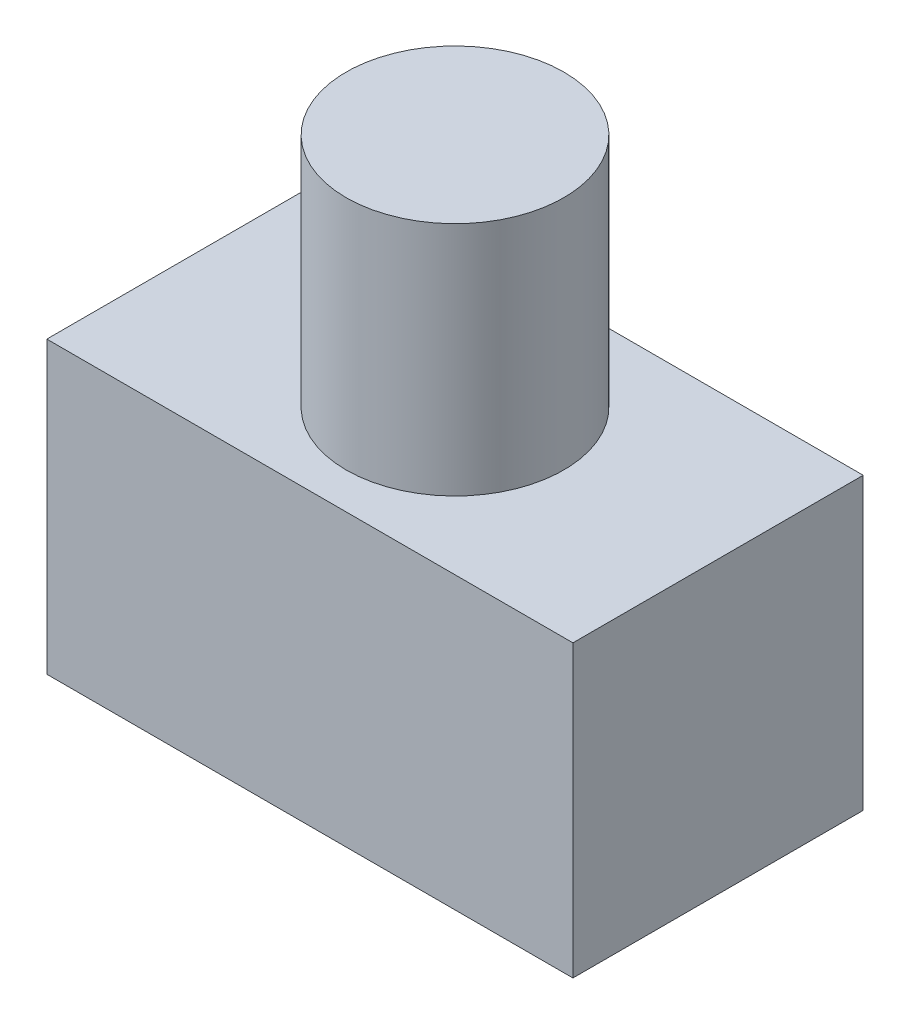
ISO-10303-21;
HEADER;
FILE_DESCRIPTION(('STEP AP214'),'2;1');
FILE_NAME('part.step','',(''),(''),'','','');
FILE_SCHEMA(('AUTOMOTIVE_DESIGN { 1 0 10303 214 1 1 1 1 }'));
ENDSEC;
DATA;
#1=APPLICATION_CONTEXT('core data for automotive mechanical design processes');
#2=APPLICATION_PROTOCOL_DEFINITION('international standard','automotive_design',2000,#1);
#3=PRODUCT_CONTEXT('',#1,'mechanical');
#4=PRODUCT('Part','Part','',(#3));
#5=PRODUCT_RELATED_PRODUCT_CATEGORY('part','',(#4));
#6=PRODUCT_DEFINITION_FORMATION('','',#4);
#7=PRODUCT_DEFINITION_CONTEXT('part definition',#1,'design');
#8=PRODUCT_DEFINITION('design','',#6,#7);
#9=PRODUCT_DEFINITION_SHAPE('','',#8);
#10=(LENGTH_UNIT() NAMED_UNIT(*) SI_UNIT(.MILLI.,.METRE.));
#11=(NAMED_UNIT(*) PLANE_ANGLE_UNIT() SI_UNIT($,.RADIAN.));
#12=(NAMED_UNIT(*) SI_UNIT($,.STERADIAN.) SOLID_ANGLE_UNIT());
#13=UNCERTAINTY_MEASURE_WITH_UNIT(LENGTH_MEASURE(1.E-05),#10,'distance_accuracy_value','');
#14=(GEOMETRIC_REPRESENTATION_CONTEXT(3) GLOBAL_UNCERTAINTY_ASSIGNED_CONTEXT((#13)) GLOBAL_UNIT_ASSIGNED_CONTEXT((#10,
#11,#12)) REPRESENTATION_CONTEXT('',''));
#15=CARTESIAN_POINT('',(0.,0.,0.));
#16=DIRECTION('',(0.,0.,1.));
#17=DIRECTION('',(1.,0.,0.));
#18=AXIS2_PLACEMENT_3D('',#15,#16,#17);
#19=CARTESIAN_POINT('',(14.5,16.,-8.));
#20=DIRECTION('',(-1.,0.,0.));
#21=DIRECTION('',(0.,0.,1.));
#22=AXIS2_PLACEMENT_3D('',#19,#20,#21);
#23=PLANE('',#22);
#24=DIRECTION('',(0.,0.,-1.));
#25=VECTOR('',#24,1.);
#26=CARTESIAN_POINT('',(14.5,0.,-8.));
#27=LINE('',#26,#25);
#28=CARTESIAN_POINT('',(14.5,0.,8.));
#29=VERTEX_POINT('',#28);
#30=CARTESIAN_POINT('',(14.5,0.,-8.));
#31=VERTEX_POINT('',#30);
#32=EDGE_CURVE('E95',#29,#31,#27,.T.);
#33=ORIENTED_EDGE('',*,*,#32,.T.);
#34=DIRECTION('',(0.,-1.,0.));
#35=VECTOR('',#34,1.);
#36=CARTESIAN_POINT('',(14.5,16.,-8.));
#37=LINE('',#36,#35);
#38=CARTESIAN_POINT('',(14.5,16.,-8.));
#39=VERTEX_POINT('',#38);
#40=EDGE_CURVE('E11',#39,#31,#37,.T.);
#41=ORIENTED_EDGE('',*,*,#40,.F.);
#42=DIRECTION('',(0.,0.,-1.));
#43=VECTOR('',#42,1.);
#44=CARTESIAN_POINT('',(14.5,16.,-8.));
#45=LINE('',#44,#43);
#46=CARTESIAN_POINT('',(14.5,16.,8.));
#47=VERTEX_POINT('',#46);
#48=EDGE_CURVE('E83',#47,#39,#45,.T.);
#49=ORIENTED_EDGE('',*,*,#48,.F.);
#50=DIRECTION('',(0.,-1.,0.));
#51=VECTOR('',#50,1.);
#52=CARTESIAN_POINT('',(14.5,16.,8.));
#53=LINE('',#52,#51);
#54=EDGE_CURVE('E91',#47,#29,#53,.T.);
#55=ORIENTED_EDGE('',*,*,#54,.T.);
#56=EDGE_LOOP('',(#33,#41,#49,#55));
#57=FACE_BOUND('',#56,.T.);
#58=ADVANCED_FACE('F32',(#57),#23,.F.);
#59=CARTESIAN_POINT('',(-14.5,16.,-8.));
#60=DIRECTION('',(0.,0.,1.));
#61=DIRECTION('',(1.,0.,0.));
#62=AXIS2_PLACEMENT_3D('',#59,#60,#61);
#63=PLANE('',#62);
#64=DIRECTION('',(-1.,0.,0.));
#65=VECTOR('',#64,1.);
#66=CARTESIAN_POINT('',(-14.5,0.,-8.));
#67=LINE('',#66,#65);
#68=CARTESIAN_POINT('',(-14.5,0.,-8.));
#69=VERTEX_POINT('',#68);
#70=EDGE_CURVE('E87',#31,#69,#67,.T.);
#71=ORIENTED_EDGE('',*,*,#70,.T.);
#72=DIRECTION('',(0.,-1.,0.));
#73=VECTOR('',#72,1.);
#74=CARTESIAN_POINT('',(-14.5,16.,-8.));
#75=LINE('',#74,#73);
#76=CARTESIAN_POINT('',(-14.5,16.,-8.));
#77=VERTEX_POINT('',#76);
#78=EDGE_CURVE('E40',#77,#69,#75,.T.);
#79=ORIENTED_EDGE('',*,*,#78,.F.);
#80=DIRECTION('',(-1.,0.,0.));
#81=VECTOR('',#80,1.);
#82=CARTESIAN_POINT('',(-14.5,16.,-8.));
#83=LINE('',#82,#81);
#84=EDGE_CURVE('E78',#39,#77,#83,.T.);
#85=ORIENTED_EDGE('',*,*,#84,.F.);
#86=ORIENTED_EDGE('',*,*,#40,.T.);
#87=EDGE_LOOP('',(#71,#79,#85,#86));
#88=FACE_BOUND('',#87,.T.);
#89=ADVANCED_FACE('F86',(#88),#63,.F.);
#90=CARTESIAN_POINT('',(-14.5,16.,-8.));
#91=DIRECTION('',(1.,0.,0.));
#92=DIRECTION('',(0.,0.,-1.));
#93=AXIS2_PLACEMENT_3D('',#90,#91,#92);
#94=PLANE('',#93);
#95=DIRECTION('',(0.,0.,1.));
#96=VECTOR('',#95,1.);
#97=CARTESIAN_POINT('',(-14.5,0.,-8.));
#98=LINE('',#97,#96);
#99=CARTESIAN_POINT('',(-14.5,0.,8.));
#100=VERTEX_POINT('',#99);
#101=EDGE_CURVE('E65',#69,#100,#98,.T.);
#102=ORIENTED_EDGE('',*,*,#101,.T.);
#103=DIRECTION('',(0.,-1.,0.));
#104=VECTOR('',#103,1.);
#105=CARTESIAN_POINT('',(-14.5,16.,8.));
#106=LINE('',#105,#104);
#107=CARTESIAN_POINT('',(-14.5,16.,8.));
#108=VERTEX_POINT('',#107);
#109=EDGE_CURVE('E88',#108,#100,#106,.T.);
#110=ORIENTED_EDGE('',*,*,#109,.F.);
#111=DIRECTION('',(0.,0.,1.));
#112=VECTOR('',#111,1.);
#113=CARTESIAN_POINT('',(-14.5,16.,-8.));
#114=LINE('',#113,#112);
#115=EDGE_CURVE('E81',#77,#108,#114,.T.);
#116=ORIENTED_EDGE('',*,*,#115,.F.);
#117=ORIENTED_EDGE('',*,*,#78,.T.);
#118=EDGE_LOOP('',(#102,#110,#116,#117));
#119=FACE_BOUND('',#118,.T.);
#120=ADVANCED_FACE('F89',(#119),#94,.F.);
#121=CARTESIAN_POINT('',(-14.5,16.,8.));
#122=DIRECTION('',(0.,0.,-1.));
#123=DIRECTION('',(-1.,0.,0.));
#124=AXIS2_PLACEMENT_3D('',#121,#122,#123);
#125=PLANE('',#124);
#126=DIRECTION('',(1.,0.,0.));
#127=VECTOR('',#126,1.);
#128=CARTESIAN_POINT('',(-14.5,0.,8.));
#129=LINE('',#128,#127);
#130=EDGE_CURVE('E71',#100,#29,#129,.T.);
#131=ORIENTED_EDGE('',*,*,#130,.T.);
#132=ORIENTED_EDGE('',*,*,#54,.F.);
#133=DIRECTION('',(1.,0.,0.));
#134=VECTOR('',#133,1.);
#135=CARTESIAN_POINT('',(-14.5,16.,8.));
#136=LINE('',#135,#134);
#137=EDGE_CURVE('E48',#108,#47,#136,.T.);
#138=ORIENTED_EDGE('',*,*,#137,.F.);
#139=ORIENTED_EDGE('',*,*,#109,.T.);
#140=EDGE_LOOP('',(#131,#132,#138,#139));
#141=FACE_BOUND('',#140,.T.);
#142=ADVANCED_FACE('F103',(#141),#125,.F.);
#143=CARTESIAN_POINT('',(0.,16.,0.));
#144=DIRECTION('',(0.,1.,0.));
#145=DIRECTION('',(0.,0.,1.));
#146=AXIS2_PLACEMENT_3D('',#143,#144,#145);
#147=PLANE('',#146);
#148=CARTESIAN_POINT('',(0.,16.,0.));
#149=DIRECTION('',(0.,1.,0.));
#150=DIRECTION('',(0.,0.,1.));
#151=AXIS2_PLACEMENT_3D('',#148,#149,#150);
#152=CIRCLE('',#151,6.);
#153=CARTESIAN_POINT('',(0.,16.,-6.));
#154=VERTEX_POINT('',#153);
#155=EDGE_CURVE('E109',#154,#154,#152,.T.);
#156=ORIENTED_EDGE('',*,*,#155,.F.);
#157=EDGE_LOOP('',(#156));
#158=FACE_BOUND('',#157,.T.);
#159=ORIENTED_EDGE('',*,*,#48,.T.);
#160=ORIENTED_EDGE('',*,*,#84,.T.);
#161=ORIENTED_EDGE('',*,*,#115,.T.);
#162=ORIENTED_EDGE('',*,*,#137,.T.);
#163=EDGE_LOOP('',(#159,#160,#161,#162));
#164=FACE_BOUND('',#163,.T.);
#165=ADVANCED_FACE('F79',(#158,#164),#147,.T.);
#166=CARTESIAN_POINT('',(0.,0.,0.));
#167=DIRECTION('',(0.,1.,0.));
#168=DIRECTION('',(0.,0.,1.));
#169=AXIS2_PLACEMENT_3D('',#166,#167,#168);
#170=PLANE('',#169);
#171=ORIENTED_EDGE('',*,*,#32,.F.);
#172=ORIENTED_EDGE('',*,*,#130,.F.);
#173=ORIENTED_EDGE('',*,*,#101,.F.);
#174=ORIENTED_EDGE('',*,*,#70,.F.);
#175=EDGE_LOOP('',(#171,#172,#173,#174));
#176=FACE_BOUND('',#175,.T.);
#177=ADVANCED_FACE('F106',(#176),#170,.F.);
#178=CARTESIAN_POINT('',(0.,29.,0.));
#179=DIRECTION('',(0.,-1.,0.));
#180=DIRECTION('',(0.,0.,-1.));
#181=AXIS2_PLACEMENT_3D('',#178,#179,#180);
#182=CYLINDRICAL_SURFACE('',#181,6.);
#183=CARTESIAN_POINT('',(0.,29.,0.));
#184=DIRECTION('',(0.,1.,0.));
#185=DIRECTION('',(0.,0.,1.));
#186=AXIS2_PLACEMENT_3D('',#183,#184,#185);
#187=CIRCLE('',#186,6.);
#188=CARTESIAN_POINT('',(0.,29.,-6.));
#189=VERTEX_POINT('',#188);
#190=EDGE_CURVE('E98',#189,#189,#187,.T.);
#191=CARTESIAN_POINT('',(0.,29.,-6.));
#192=CARTESIAN_POINT('',(0.,28.8645833333333,-6.));
#193=CARTESIAN_POINT('',(0.,28.7291666666667,-6.));
#194=CARTESIAN_POINT('',(0.,28.4583333333333,-6.));
#195=CARTESIAN_POINT('',(0.,28.3229166666667,-6.));
#196=CARTESIAN_POINT('',(0.,28.0520833333333,-6.));
#197=CARTESIAN_POINT('',(0.,27.9166666666667,-6.));
#198=CARTESIAN_POINT('',(0.,27.6458333333333,-6.));
#199=CARTESIAN_POINT('',(0.,27.5104166666667,-6.));
#200=CARTESIAN_POINT('',(0.,27.2395833333333,-6.));
#201=CARTESIAN_POINT('',(0.,27.1041666666667,-6.));
#202=CARTESIAN_POINT('',(0.,26.8333333333333,-6.));
#203=CARTESIAN_POINT('',(0.,26.6979166666667,-6.));
#204=CARTESIAN_POINT('',(0.,26.4270833333333,-6.));
#205=CARTESIAN_POINT('',(0.,26.2916666666667,-6.));
#206=CARTESIAN_POINT('',(0.,26.0208333333333,-6.));
#207=CARTESIAN_POINT('',(0.,25.8854166666667,-6.));
#208=CARTESIAN_POINT('',(0.,25.6145833333333,-6.));
#209=CARTESIAN_POINT('',(0.,25.4791666666667,-6.));
#210=CARTESIAN_POINT('',(0.,25.2083333333333,-6.));
#211=CARTESIAN_POINT('',(0.,25.0729166666667,-6.));
#212=CARTESIAN_POINT('',(0.,24.8020833333333,-6.));
#213=CARTESIAN_POINT('',(0.,24.6666666666667,-6.));
#214=CARTESIAN_POINT('',(0.,24.3958333333333,-6.));
#215=CARTESIAN_POINT('',(0.,24.2604166666667,-6.));
#216=CARTESIAN_POINT('',(0.,23.9895833333333,-6.));
#217=CARTESIAN_POINT('',(0.,23.8541666666667,-6.));
#218=CARTESIAN_POINT('',(0.,23.5833333333333,-6.));
#219=CARTESIAN_POINT('',(0.,23.4479166666667,-6.));
#220=CARTESIAN_POINT('',(0.,23.1770833333333,-6.));
#221=CARTESIAN_POINT('',(0.,23.0416666666667,-6.));
#222=CARTESIAN_POINT('',(0.,22.7708333333333,-6.));
#223=CARTESIAN_POINT('',(0.,22.6354166666667,-6.));
#224=CARTESIAN_POINT('',(0.,22.3645833333333,-6.));
#225=CARTESIAN_POINT('',(0.,22.2291666666667,-6.));
#226=CARTESIAN_POINT('',(0.,21.9583333333333,-6.));
#227=CARTESIAN_POINT('',(0.,21.8229166666667,-6.));
#228=CARTESIAN_POINT('',(0.,21.5520833333333,-6.));
#229=CARTESIAN_POINT('',(0.,21.4166666666667,-6.));
#230=CARTESIAN_POINT('',(0.,21.1458333333333,-6.));
#231=CARTESIAN_POINT('',(0.,21.0104166666667,-6.));
#232=CARTESIAN_POINT('',(0.,20.7395833333333,-6.));
#233=CARTESIAN_POINT('',(0.,20.6041666666667,-6.));
#234=CARTESIAN_POINT('',(0.,20.3333333333333,-6.));
#235=CARTESIAN_POINT('',(0.,20.1979166666667,-6.));
#236=CARTESIAN_POINT('',(0.,19.9270833333333,-6.));
#237=CARTESIAN_POINT('',(0.,19.7916666666667,-6.));
#238=CARTESIAN_POINT('',(0.,19.5208333333333,-6.));
#239=CARTESIAN_POINT('',(0.,19.3854166666667,-6.));
#240=CARTESIAN_POINT('',(0.,19.1145833333333,-6.));
#241=CARTESIAN_POINT('',(0.,18.9791666666667,-6.));
#242=CARTESIAN_POINT('',(0.,18.7083333333333,-6.));
#243=CARTESIAN_POINT('',(0.,18.5729166666667,-6.));
#244=CARTESIAN_POINT('',(0.,18.3020833333333,-6.));
#245=CARTESIAN_POINT('',(0.,18.1666666666667,-6.));
#246=CARTESIAN_POINT('',(0.,17.8958333333333,-6.));
#247=CARTESIAN_POINT('',(0.,17.7604166666667,-6.));
#248=CARTESIAN_POINT('',(0.,17.4895833333333,-6.));
#249=CARTESIAN_POINT('',(0.,17.3541666666667,-6.));
#250=CARTESIAN_POINT('',(0.,17.0833333333333,-6.));
#251=CARTESIAN_POINT('',(0.,16.9479166666667,-6.));
#252=CARTESIAN_POINT('',(0.,16.6770833333333,-6.));
#253=CARTESIAN_POINT('',(0.,16.5416666666667,-6.));
#254=CARTESIAN_POINT('',(0.,16.2708333333333,-6.));
#255=CARTESIAN_POINT('',(0.,16.1354166666667,-6.));
#256=CARTESIAN_POINT('',(0.,16.,-6.));
#257=B_SPLINE_CURVE_WITH_KNOTS('',3,(#191,#192,#193,#194,#195,#196,#197,#198,#199,#200,#201,
#202,#203,#204,#205,#206,#207,#208,#209,#210,#211,#212,#213,#214,#215,#216,#217,#218,#219,#220,
#221,#222,#223,#224,#225,#226,#227,#228,#229,#230,#231,#232,#233,#234,#235,#236,#237,#238,#239,
#240,#241,#242,#243,#244,#245,#246,#247,#248,#249,#250,#251,#252,#253,#254,#255,#256),
.UNSPECIFIED.,.F.,.F.,(4,2,2,2,2,2,2,2,2,2,2,2,2,2,2,2,2,2,2,2,2,2,2,2,2,2,2,2,2,2,2,2,4),(0.,
0.40625,0.812500000000001,1.21875,1.625,2.03125,2.4375,2.84375,3.25,3.65625,4.0625,4.46875,
4.875,5.28125,5.6875,6.09375,6.5,6.90625,7.3125,7.71875,8.125,8.53125,8.9375,9.34375,9.75,
10.15625,10.5625,10.96875,11.375,11.78125,12.1875,12.59375,13.),.UNSPECIFIED.);
#258=EDGE_CURVE('BSEAM117',#189,#154,#257,.T.);
#259=ORIENTED_EDGE('',*,*,#190,.F.);
#260=ORIENTED_EDGE('',*,*,#155,.T.);
#261=ORIENTED_EDGE('',*,*,#258,.T.);
#262=ORIENTED_EDGE('',*,*,#258,.F.);
#263=EDGE_LOOP('',(#259,#261,#260,#262));
#264=FACE_BOUND('',#263,.T.);
#265=ADVANCED_FACE('F117',(#264),#182,.T.);
#266=CARTESIAN_POINT('',(0.,29.,0.));
#267=DIRECTION('',(0.,1.,0.));
#268=DIRECTION('',(0.,0.,1.));
#269=AXIS2_PLACEMENT_3D('',#266,#267,#268);
#270=PLANE('',#269);
#271=ORIENTED_EDGE('',*,*,#190,.T.);
#272=EDGE_LOOP('',(#271));
#273=FACE_BOUND('',#272,.T.);
#274=ADVANCED_FACE('F115',(#273),#270,.T.);
#275=CLOSED_SHELL('',(#58,#89,#120,#142,#165,#177,#265,#274));
#276=MANIFOLD_SOLID_BREP('B2',#275);
#277=ADVANCED_BREP_SHAPE_REPRESENTATION('',(#18,#276),#14);
#278=SHAPE_DEFINITION_REPRESENTATION(#9,#277);
ENDSEC;
END-ISO-10303-21;
